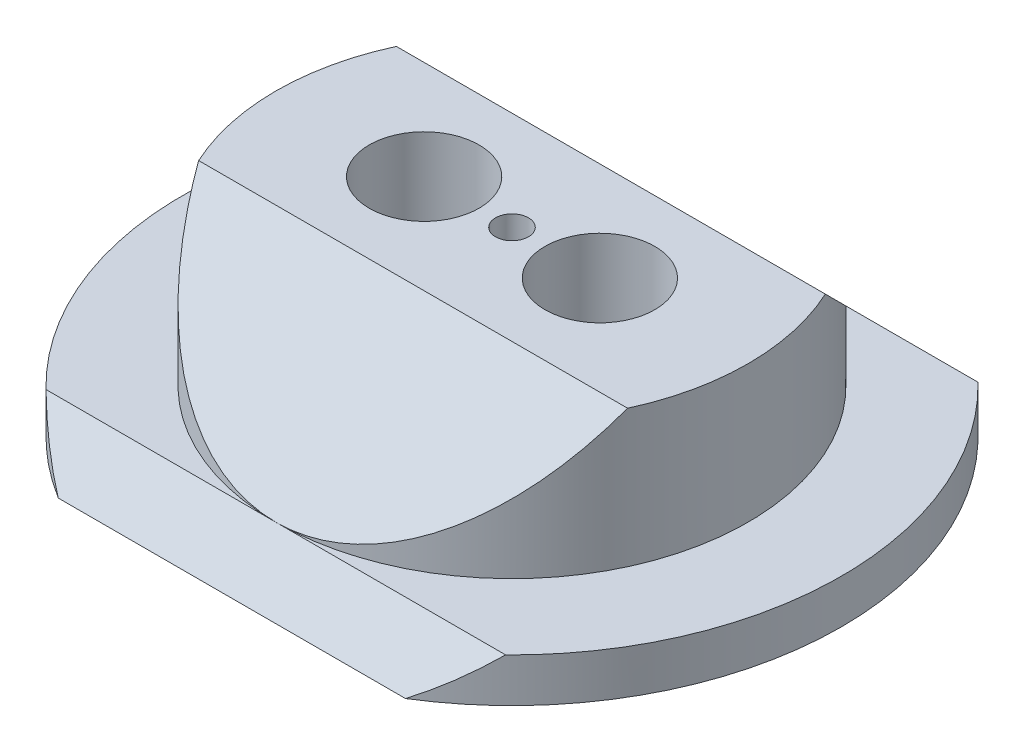
ISO-10303-21;
HEADER;
FILE_DESCRIPTION(('STEP AP214'),'2;1');
FILE_NAME('part.step','',(''),(''),'','','');
FILE_SCHEMA(('AUTOMOTIVE_DESIGN { 1 0 10303 214 1 1 1 1 }'));
ENDSEC;
DATA;
#1=APPLICATION_CONTEXT('core data for automotive mechanical design processes');
#2=APPLICATION_PROTOCOL_DEFINITION('international standard','automotive_design',2000,#1);
#3=PRODUCT_CONTEXT('',#1,'mechanical');
#4=PRODUCT('Part','Part','',(#3));
#5=PRODUCT_RELATED_PRODUCT_CATEGORY('part','',(#4));
#6=PRODUCT_DEFINITION_FORMATION('','',#4);
#7=PRODUCT_DEFINITION_CONTEXT('part definition',#1,'design');
#8=PRODUCT_DEFINITION('design','',#6,#7);
#9=PRODUCT_DEFINITION_SHAPE('','',#8);
#10=(LENGTH_UNIT() NAMED_UNIT(*) SI_UNIT(.MILLI.,.METRE.));
#11=(NAMED_UNIT(*) PLANE_ANGLE_UNIT() SI_UNIT($,.RADIAN.));
#12=(NAMED_UNIT(*) SI_UNIT($,.STERADIAN.) SOLID_ANGLE_UNIT());
#13=UNCERTAINTY_MEASURE_WITH_UNIT(LENGTH_MEASURE(1.E-05),#10,'distance_accuracy_value','');
#14=(GEOMETRIC_REPRESENTATION_CONTEXT(3) GLOBAL_UNCERTAINTY_ASSIGNED_CONTEXT((#13)) GLOBAL_UNIT_ASSIGNED_CONTEXT((#10,
#11,#12)) REPRESENTATION_CONTEXT('',''));
#15=CARTESIAN_POINT('',(0.,0.,0.));
#16=DIRECTION('',(0.,0.,1.));
#17=DIRECTION('',(1.,0.,0.));
#18=AXIS2_PLACEMENT_3D('',#15,#16,#17);
#19=CARTESIAN_POINT('',(0.,0.,0.));
#20=DIRECTION('',(0.,1.,0.));
#21=DIRECTION('',(0.,0.,1.));
#22=AXIS2_PLACEMENT_3D('',#19,#20,#21);
#23=PLANE('',#22);
#24=CARTESIAN_POINT('',(22.,0.,0.));
#25=DIRECTION('',(0.,-1.,0.));
#26=DIRECTION('',(0.,0.,-1.));
#27=AXIS2_PLACEMENT_3D('',#24,#25,#26);
#28=CIRCLE('',#27,5.);
#29=CARTESIAN_POINT('',(22.,0.,-5.));
#30=VERTEX_POINT('',#29);
#31=EDGE_CURVE('E254',#30,#30,#28,.T.);
#32=ORIENTED_EDGE('',*,*,#31,.F.);
#33=EDGE_LOOP('',(#32));
#34=FACE_BOUND('',#33,.T.);
#35=CARTESIAN_POINT('',(0.,0.,15.));
#36=DIRECTION('',(0.,-1.,0.));
#37=DIRECTION('',(0.,0.,-1.));
#38=AXIS2_PLACEMENT_3D('',#35,#36,#37);
#39=CIRCLE('',#38,5.);
#40=CARTESIAN_POINT('',(0.,0.,10.));
#41=VERTEX_POINT('',#40);
#42=EDGE_CURVE('E246',#41,#41,#39,.T.);
#43=ORIENTED_EDGE('',*,*,#42,.F.);
#44=EDGE_LOOP('',(#43));
#45=FACE_BOUND('',#44,.T.);
#46=CARTESIAN_POINT('',(-22.,0.,0.));
#47=DIRECTION('',(0.,-1.,0.));
#48=DIRECTION('',(0.,0.,-1.));
#49=AXIS2_PLACEMENT_3D('',#46,#47,#48);
#50=CIRCLE('',#49,5.);
#51=CARTESIAN_POINT('',(-22.,0.,-5.));
#52=VERTEX_POINT('',#51);
#53=EDGE_CURVE('E238',#52,#52,#50,.T.);
#54=ORIENTED_EDGE('',*,*,#53,.F.);
#55=EDGE_LOOP('',(#54));
#56=FACE_BOUND('',#55,.T.);
#57=CARTESIAN_POINT('',(-14.,0.,12.));
#58=DIRECTION('',(0.,-1.,0.));
#59=DIRECTION('',(0.,0.,-1.));
#60=AXIS2_PLACEMENT_3D('',#57,#58,#59);
#61=CIRCLE('',#60,5.);
#62=CARTESIAN_POINT('',(-14.,0.,7.));
#63=VERTEX_POINT('',#62);
#64=EDGE_CURVE('E229',#63,#63,#61,.T.);
#65=ORIENTED_EDGE('',*,*,#64,.F.);
#66=EDGE_LOOP('',(#65));
#67=FACE_BOUND('',#66,.T.);
#68=CARTESIAN_POINT('',(14.,0.,12.));
#69=DIRECTION('',(0.,-1.,0.));
#70=DIRECTION('',(0.,0.,-1.));
#71=AXIS2_PLACEMENT_3D('',#68,#69,#70);
#72=CIRCLE('',#71,5.);
#73=CARTESIAN_POINT('',(14.,0.,7.));
#74=VERTEX_POINT('',#73);
#75=EDGE_CURVE('E277',#74,#74,#72,.T.);
#76=ORIENTED_EDGE('',*,*,#75,.F.);
#77=EDGE_LOOP('',(#76));
#78=FACE_BOUND('',#77,.T.);
#79=CARTESIAN_POINT('',(14.,0.,-12.));
#80=DIRECTION('',(0.,-1.,0.));
#81=DIRECTION('',(0.,0.,-1.));
#82=AXIS2_PLACEMENT_3D('',#79,#80,#81);
#83=CIRCLE('',#82,5.);
#84=CARTESIAN_POINT('',(14.,0.,-17.));
#85=VERTEX_POINT('',#84);
#86=EDGE_CURVE('E269',#85,#85,#83,.T.);
#87=ORIENTED_EDGE('',*,*,#86,.F.);
#88=EDGE_LOOP('',(#87));
#89=FACE_BOUND('',#88,.T.);
#90=CARTESIAN_POINT('',(-14.,0.,-12.));
#91=DIRECTION('',(0.,-1.,0.));
#92=DIRECTION('',(0.,0.,-1.));
#93=AXIS2_PLACEMENT_3D('',#90,#91,#92);
#94=CIRCLE('',#93,5.);
#95=CARTESIAN_POINT('',(-14.,0.,-17.));
#96=VERTEX_POINT('',#95);
#97=EDGE_CURVE('E261',#96,#96,#94,.T.);
#98=ORIENTED_EDGE('',*,*,#97,.F.);
#99=EDGE_LOOP('',(#98));
#100=FACE_BOUND('',#99,.T.);
#101=CARTESIAN_POINT('',(0.,0.,-15.));
#102=DIRECTION('',(0.,-1.,0.));
#103=DIRECTION('',(0.,0.,-1.));
#104=AXIS2_PLACEMENT_3D('',#101,#102,#103);
#105=CIRCLE('',#104,5.);
#106=CARTESIAN_POINT('',(0.,0.,-20.));
#107=VERTEX_POINT('',#106);
#108=EDGE_CURVE('E221',#107,#107,#105,.T.);
#109=ORIENTED_EDGE('',*,*,#108,.F.);
#110=EDGE_LOOP('',(#109));
#111=FACE_BOUND('',#110,.T.);
#112=CARTESIAN_POINT('',(0.,0.,0.));
#113=DIRECTION('',(0.,1.,0.));
#114=DIRECTION('',(0.,0.,1.));
#115=AXIS2_PLACEMENT_3D('',#112,#113,#114);
#116=CIRCLE('',#115,1.5);
#117=CARTESIAN_POINT('',(0.,0.,1.5));
#118=VERTEX_POINT('',#117);
#119=EDGE_CURVE('E209',#118,#118,#116,.T.);
#120=ORIENTED_EDGE('',*,*,#119,.T.);
#121=EDGE_LOOP('',(#120));
#122=FACE_BOUND('',#121,.T.);
#123=CARTESIAN_POINT('',(-8.,0.,0.));
#124=DIRECTION('',(0.,1.,0.));
#125=DIRECTION('',(0.,0.,1.));
#126=AXIS2_PLACEMENT_3D('',#123,#124,#125);
#127=CIRCLE('',#126,5.);
#128=CARTESIAN_POINT('',(-8.,0.,5.));
#129=VERTEX_POINT('',#128);
#130=EDGE_CURVE('E196',#129,#129,#127,.T.);
#131=ORIENTED_EDGE('',*,*,#130,.T.);
#132=EDGE_LOOP('',(#131));
#133=FACE_BOUND('',#132,.T.);
#134=CARTESIAN_POINT('',(8.,0.,0.));
#135=DIRECTION('',(0.,1.,0.));
#136=DIRECTION('',(0.,0.,1.));
#137=AXIS2_PLACEMENT_3D('',#134,#135,#136);
#138=CIRCLE('',#137,5.);
#139=CARTESIAN_POINT('',(8.,0.,5.));
#140=VERTEX_POINT('',#139);
#141=EDGE_CURVE('E200',#140,#140,#138,.T.);
#142=ORIENTED_EDGE('',*,*,#141,.T.);
#143=EDGE_LOOP('',(#142));
#144=FACE_BOUND('',#143,.T.);
#145=DIRECTION('',(1.,0.,0.));
#146=VECTOR('',#145,1.);
#147=CARTESIAN_POINT('',(0.,0.,25.5));
#148=LINE('',#147,#146);
#149=CARTESIAN_POINT('',(-15.8034806292791,0.,25.5));
#150=VERTEX_POINT('',#149);
#151=CARTESIAN_POINT('',(15.8034806292791,0.,25.5));
#152=VERTEX_POINT('',#151);
#153=EDGE_CURVE('E175',#150,#152,#148,.T.);
#154=ORIENTED_EDGE('',*,*,#153,.F.);
#155=CARTESIAN_POINT('',(0.,0.,0.));
#156=DIRECTION('',(0.,1.,0.));
#157=DIRECTION('',(0.,0.,1.));
#158=AXIS2_PLACEMENT_3D('',#155,#156,#157);
#159=CIRCLE('',#158,30.);
#160=CARTESIAN_POINT('',(-15.8034806292789,0.,-25.5000000000001));
#161=VERTEX_POINT('',#160);
#162=EDGE_CURVE('E128',#161,#150,#159,.T.);
#163=ORIENTED_EDGE('',*,*,#162,.F.);
#164=DIRECTION('',(-1.,0.,0.));
#165=VECTOR('',#164,1.);
#166=CARTESIAN_POINT('',(0.,0.,-25.5000000000001));
#167=LINE('',#166,#165);
#168=CARTESIAN_POINT('',(15.8034806292789,0.,-25.5000000000001));
#169=VERTEX_POINT('',#168);
#170=EDGE_CURVE('E172',#169,#161,#167,.T.);
#171=ORIENTED_EDGE('',*,*,#170,.F.);
#172=EDGE_CURVE('E155',#152,#169,#159,.T.);
#173=ORIENTED_EDGE('',*,*,#172,.F.);
#174=EDGE_LOOP('',(#154,#163,#171,#173));
#175=FACE_BOUND('',#174,.T.);
#176=ADVANCED_FACE('F57',(#34,#45,#56,#67,#78,#89,#100,#111,#122,#133,#144,#175),#23,.F.);
#177=CARTESIAN_POINT('',(0.,4.,0.));
#178=DIRECTION('',(0.,-1.,0.));
#179=DIRECTION('',(0.,0.,-1.));
#180=AXIS2_PLACEMENT_3D('',#177,#178,#179);
#181=CYLINDRICAL_SURFACE('',#180,30.);
#182=CARTESIAN_POINT('',(0.,4.,0.));
#183=DIRECTION('',(0.,1.,0.));
#184=DIRECTION('',(0.,0.,1.));
#185=AXIS2_PLACEMENT_3D('',#182,#183,#184);
#186=CIRCLE('',#185,30.);
#187=CARTESIAN_POINT('',(20.9224759529077,4.,21.5));
#188=VERTEX_POINT('',#187);
#189=CARTESIAN_POINT('',(20.9224759529077,4.,-21.5));
#190=VERTEX_POINT('',#189);
#191=EDGE_CURVE('E183',#188,#190,#186,.T.);
#192=ORIENTED_EDGE('',*,*,#191,.F.);
#193=CARTESIAN_POINT('',(0.,25.4999999999998,0.));
#194=DIRECTION('',(0.,-0.707106781186551,-0.707106781186544));
#195=DIRECTION('',(0.,-0.707106781186544,0.707106781186551));
#196=AXIS2_PLACEMENT_3D('',#193,#194,#195);
#197=ELLIPSE('',#196,42.4264068711926,30.);
#198=EDGE_CURVE('E80',#152,#188,#197,.F.);
#199=ORIENTED_EDGE('',*,*,#198,.F.);
#200=ORIENTED_EDGE('',*,*,#172,.T.);
#201=CARTESIAN_POINT('',(0.,25.4999999999995,0.));
#202=DIRECTION('',(0.,-0.707106781186556,0.707106781186539));
#203=DIRECTION('',(0.,-0.707106781186539,-0.707106781186556));
#204=AXIS2_PLACEMENT_3D('',#201,#202,#203);
#205=ELLIPSE('',#204,42.4264068711924,30.);
#206=EDGE_CURVE('E147',#190,#169,#205,.F.);
#207=ORIENTED_EDGE('',*,*,#206,.F.);
#208=EDGE_LOOP('',(#192,#199,#200,#207));
#209=FACE_BOUND('',#208,.T.);
#210=ADVANCED_FACE('F59',(#209),#181,.T.);
#211=CARTESIAN_POINT('',(0.,4.,0.));
#212=DIRECTION('',(0.,1.,0.));
#213=DIRECTION('',(0.,0.,1.));
#214=AXIS2_PLACEMENT_3D('',#211,#212,#213);
#215=CIRCLE('',#214,30.);
#216=CARTESIAN_POINT('',(-20.9224759529077,4.,-21.5));
#217=VERTEX_POINT('',#216);
#218=CARTESIAN_POINT('',(-20.9224759529077,4.,21.5));
#219=VERTEX_POINT('',#218);
#220=EDGE_CURVE('E186',#217,#219,#215,.T.);
#221=ORIENTED_EDGE('',*,*,#220,.F.);
#222=CARTESIAN_POINT('',(0.,25.4999999999995,0.));
#223=DIRECTION('',(0.,0.707106781186556,-0.707106781186539));
#224=DIRECTION('',(0.,-0.707106781186539,-0.707106781186556));
#225=AXIS2_PLACEMENT_3D('',#222,#223,#224);
#226=ELLIPSE('',#225,42.4264068711924,30.);
#227=EDGE_CURVE('E169',#217,#161,#226,.F.);
#228=ORIENTED_EDGE('',*,*,#227,.T.);
#229=ORIENTED_EDGE('',*,*,#162,.T.);
#230=CARTESIAN_POINT('',(0.,25.4999999999998,0.));
#231=DIRECTION('',(0.,0.707106781186551,0.707106781186544));
#232=DIRECTION('',(0.,-0.707106781186544,0.707106781186551));
#233=AXIS2_PLACEMENT_3D('',#230,#231,#232);
#234=ELLIPSE('',#233,42.4264068711926,30.);
#235=EDGE_CURVE('E149',#150,#219,#234,.F.);
#236=ORIENTED_EDGE('',*,*,#235,.T.);
#237=EDGE_LOOP('',(#221,#228,#229,#236));
#238=FACE_BOUND('',#237,.T.);
#239=ADVANCED_FACE('F316',(#238),#181,.T.);
#240=CARTESIAN_POINT('',(30.001,16.5,8.99999999999987));
#241=DIRECTION('',(0.,-0.707106781186551,-0.707106781186544));
#242=DIRECTION('',(0.,0.707106781186544,-0.707106781186551));
#243=AXIS2_PLACEMENT_3D('',#240,#241,#242);
#244=PLANE('',#243);
#245=DIRECTION('',(1.,0.,0.));
#246=VECTOR('',#245,1.);
#247=CARTESIAN_POINT('',(30.001,4.,21.5));
#248=LINE('',#247,#246);
#249=CARTESIAN_POINT('',(0.,3.99999999999999,21.5));
#250=VERTEX_POINT('',#249);
#251=EDGE_CURVE('E179',#219,#250,#248,.T.);
#252=ORIENTED_EDGE('',*,*,#251,.F.);
#253=ORIENTED_EDGE('',*,*,#235,.F.);
#254=ORIENTED_EDGE('',*,*,#153,.T.);
#255=ORIENTED_EDGE('',*,*,#198,.T.);
#256=EDGE_CURVE('E180',#250,#188,#248,.T.);
#257=ORIENTED_EDGE('',*,*,#256,.F.);
#258=EDGE_LOOP('',(#252,#253,#254,#255,#257));
#259=FACE_BOUND('',#258,.T.);
#260=ADVANCED_FACE('F312',(#259),#244,.F.);
#261=CARTESIAN_POINT('',(30.001,16.5,-8.99999999999971));
#262=DIRECTION('',(0.,-0.707106781186556,0.707106781186539));
#263=DIRECTION('',(0.,-0.707106781186539,-0.707106781186556));
#264=AXIS2_PLACEMENT_3D('',#261,#262,#263);
#265=PLANE('',#264);
#266=DIRECTION('',(-1.,0.,0.));
#267=VECTOR('',#266,1.);
#268=CARTESIAN_POINT('',(30.001,4.,-21.5));
#269=LINE('',#268,#267);
#270=CARTESIAN_POINT('',(0.,4.,-21.5));
#271=VERTEX_POINT('',#270);
#272=EDGE_CURVE('E13',#190,#271,#269,.T.);
#273=ORIENTED_EDGE('',*,*,#272,.F.);
#274=ORIENTED_EDGE('',*,*,#206,.T.);
#275=ORIENTED_EDGE('',*,*,#170,.T.);
#276=ORIENTED_EDGE('',*,*,#227,.F.);
#277=EDGE_CURVE('E61',#271,#217,#269,.T.);
#278=ORIENTED_EDGE('',*,*,#277,.F.);
#279=EDGE_LOOP('',(#273,#274,#275,#276,#278));
#280=FACE_BOUND('',#279,.T.);
#281=ADVANCED_FACE('F320',(#280),#265,.F.);
#282=CARTESIAN_POINT('',(0.,96.0338927753446,0.));
#283=DIRECTION('',(0.,-1.,0.));
#284=DIRECTION('',(0.,0.,-1.));
#285=AXIS2_PLACEMENT_3D('',#282,#283,#284);
#286=CYLINDRICAL_SURFACE('',#285,21.5);
#287=CARTESIAN_POINT('',(0.,4.,0.));
#288=DIRECTION('',(0.,1.,0.));
#289=DIRECTION('',(0.,0.,1.));
#290=AXIS2_PLACEMENT_3D('',#287,#288,#289);
#291=CIRCLE('',#290,21.5);
#292=EDGE_CURVE('E124',#250,#271,#291,.T.);
#293=ORIENTED_EDGE('',*,*,#292,.T.);
#294=CARTESIAN_POINT('',(0.,25.4999999999995,0.));
#295=DIRECTION('',(0.,-0.707106781186556,0.707106781186539));
#296=DIRECTION('',(0.,-0.707106781186539,-0.707106781186556));
#297=AXIS2_PLACEMENT_3D('',#294,#295,#296);
#298=ELLIPSE('',#297,30.4055915910212,21.5);
#299=CARTESIAN_POINT('',(19.5256241897668,16.5,-8.99999999999971));
#300=VERTEX_POINT('',#299);
#301=EDGE_CURVE('E73',#300,#271,#298,.F.);
#302=ORIENTED_EDGE('',*,*,#301,.F.);
#303=CARTESIAN_POINT('',(0.,16.5,0.));
#304=DIRECTION('',(0.,-1.,0.));
#305=DIRECTION('',(0.,0.,-1.));
#306=AXIS2_PLACEMENT_3D('',#303,#304,#305);
#307=CIRCLE('',#306,21.5);
#308=CARTESIAN_POINT('',(19.5256241897667,16.5,8.99999999999987));
#309=VERTEX_POINT('',#308);
#310=EDGE_CURVE('E121',#300,#309,#307,.T.);
#311=ORIENTED_EDGE('',*,*,#310,.T.);
#312=CARTESIAN_POINT('',(0.,25.4999999999998,0.));
#313=DIRECTION('',(0.,-0.707106781186551,-0.707106781186544));
#314=DIRECTION('',(0.,-0.707106781186544,0.707106781186551));
#315=AXIS2_PLACEMENT_3D('',#312,#313,#314);
#316=ELLIPSE('',#315,30.4055915910214,21.5);
#317=EDGE_CURVE('E189',#250,#309,#316,.F.);
#318=ORIENTED_EDGE('',*,*,#317,.F.);
#319=EDGE_LOOP('',(#293,#302,#311,#318));
#320=FACE_BOUND('',#319,.T.);
#321=ADVANCED_FACE('F119',(#320),#286,.T.);
#322=CARTESIAN_POINT('',(0.,4.,0.));
#323=DIRECTION('',(0.,1.,0.));
#324=DIRECTION('',(0.,0.,1.));
#325=AXIS2_PLACEMENT_3D('',#322,#323,#324);
#326=PLANE('',#325);
#327=ORIENTED_EDGE('',*,*,#256,.T.);
#328=ORIENTED_EDGE('',*,*,#191,.T.);
#329=ORIENTED_EDGE('',*,*,#272,.T.);
#330=ORIENTED_EDGE('',*,*,#292,.F.);
#331=EDGE_LOOP('',(#327,#328,#329,#330));
#332=FACE_BOUND('',#331,.T.);
#333=ADVANCED_FACE('F333',(#332),#326,.T.);
#334=ORIENTED_EDGE('',*,*,#251,.T.);
#335=EDGE_CURVE('E195',#271,#250,#291,.T.);
#336=ORIENTED_EDGE('',*,*,#335,.F.);
#337=ORIENTED_EDGE('',*,*,#277,.T.);
#338=ORIENTED_EDGE('',*,*,#220,.T.);
#339=EDGE_LOOP('',(#334,#336,#337,#338));
#340=FACE_BOUND('',#339,.T.);
#341=ADVANCED_FACE('F323',(#340),#326,.T.);
#342=CARTESIAN_POINT('',(-19.5256241897667,16.5,8.99999999999987));
#343=VERTEX_POINT('',#342);
#344=CARTESIAN_POINT('',(-19.5256241897668,16.5,-8.99999999999971));
#345=VERTEX_POINT('',#344);
#346=EDGE_CURVE('E139',#343,#345,#307,.T.);
#347=ORIENTED_EDGE('',*,*,#346,.T.);
#348=EDGE_CURVE('E127',#271,#345,#298,.F.);
#349=ORIENTED_EDGE('',*,*,#348,.F.);
#350=ORIENTED_EDGE('',*,*,#335,.T.);
#351=EDGE_CURVE('E138',#343,#250,#316,.F.);
#352=ORIENTED_EDGE('',*,*,#351,.F.);
#353=EDGE_LOOP('',(#347,#349,#350,#352));
#354=FACE_BOUND('',#353,.T.);
#355=ADVANCED_FACE('F326',(#354),#286,.T.);
#356=ORIENTED_EDGE('',*,*,#301,.T.);
#357=ORIENTED_EDGE('',*,*,#348,.T.);
#358=DIRECTION('',(-1.,0.,0.));
#359=VECTOR('',#358,1.);
#360=CARTESIAN_POINT('',(30.001,16.5,-8.99999999999971));
#361=LINE('',#360,#359);
#362=EDGE_CURVE('E134',#300,#345,#361,.T.);
#363=ORIENTED_EDGE('',*,*,#362,.F.);
#364=EDGE_LOOP('',(#356,#357,#363));
#365=FACE_BOUND('',#364,.T.);
#366=ADVANCED_FACE('F141',(#365),#265,.F.);
#367=CARTESIAN_POINT('',(30.001,16.5,8.99999999999987));
#368=DIRECTION('',(0.,-1.,0.));
#369=DIRECTION('',(0.,0.,-1.));
#370=AXIS2_PLACEMENT_3D('',#367,#368,#369);
#371=PLANE('',#370);
#372=CARTESIAN_POINT('',(0.,16.5,0.));
#373=DIRECTION('',(0.,1.,0.));
#374=DIRECTION('',(0.,0.,1.));
#375=AXIS2_PLACEMENT_3D('',#372,#373,#374);
#376=CIRCLE('',#375,1.5);
#377=CARTESIAN_POINT('',(0.,16.5,1.50000000000001));
#378=VERTEX_POINT('',#377);
#379=EDGE_CURVE('E216',#378,#378,#376,.T.);
#380=ORIENTED_EDGE('',*,*,#379,.F.);
#381=EDGE_LOOP('',(#380));
#382=FACE_BOUND('',#381,.T.);
#383=CARTESIAN_POINT('',(-8.,16.5,0.));
#384=DIRECTION('',(0.,1.,0.));
#385=DIRECTION('',(0.,0.,1.));
#386=AXIS2_PLACEMENT_3D('',#383,#384,#385);
#387=CIRCLE('',#386,5.);
#388=CARTESIAN_POINT('',(-8.,16.5,5.00000000000001));
#389=VERTEX_POINT('',#388);
#390=EDGE_CURVE('E204',#389,#389,#387,.T.);
#391=ORIENTED_EDGE('',*,*,#390,.F.);
#392=EDGE_LOOP('',(#391));
#393=FACE_BOUND('',#392,.T.);
#394=CARTESIAN_POINT('',(8.,16.5,0.));
#395=DIRECTION('',(0.,1.,0.));
#396=DIRECTION('',(0.,0.,1.));
#397=AXIS2_PLACEMENT_3D('',#394,#395,#396);
#398=CIRCLE('',#397,5.);
#399=CARTESIAN_POINT('',(8.,16.5,5.));
#400=VERTEX_POINT('',#399);
#401=EDGE_CURVE('E205',#400,#400,#398,.T.);
#402=ORIENTED_EDGE('',*,*,#401,.F.);
#403=EDGE_LOOP('',(#402));
#404=FACE_BOUND('',#403,.T.);
#405=ORIENTED_EDGE('',*,*,#362,.T.);
#406=ORIENTED_EDGE('',*,*,#346,.F.);
#407=DIRECTION('',(-1.,0.,0.));
#408=VECTOR('',#407,1.);
#409=CARTESIAN_POINT('',(30.001,16.5,8.99999999999987));
#410=LINE('',#409,#408);
#411=EDGE_CURVE('E136',#309,#343,#410,.T.);
#412=ORIENTED_EDGE('',*,*,#411,.F.);
#413=ORIENTED_EDGE('',*,*,#310,.F.);
#414=EDGE_LOOP('',(#405,#406,#412,#413));
#415=FACE_BOUND('',#414,.T.);
#416=ADVANCED_FACE('F132',(#382,#393,#404,#415),#371,.F.);
#417=ORIENTED_EDGE('',*,*,#351,.T.);
#418=ORIENTED_EDGE('',*,*,#317,.T.);
#419=ORIENTED_EDGE('',*,*,#411,.T.);
#420=EDGE_LOOP('',(#417,#418,#419));
#421=FACE_BOUND('',#420,.T.);
#422=ADVANCED_FACE('F331',(#421),#244,.F.);
#423=CARTESIAN_POINT('',(8.,-7.50000000000001,0.));
#424=DIRECTION('',(0.,1.,0.));
#425=DIRECTION('',(0.,0.,1.));
#426=AXIS2_PLACEMENT_3D('',#423,#424,#425);
#427=CYLINDRICAL_SURFACE('',#426,5.);
#428=ORIENTED_EDGE('',*,*,#401,.T.);
#429=EDGE_LOOP('',(#428));
#430=FACE_BOUND('',#429,.T.);
#431=ORIENTED_EDGE('',*,*,#141,.F.);
#432=EDGE_LOOP('',(#431));
#433=FACE_BOUND('',#432,.T.);
#434=ADVANCED_FACE('F349',(#430,#433),#427,.F.);
#435=CARTESIAN_POINT('',(-8.,-7.50000000000001,0.));
#436=DIRECTION('',(0.,1.,0.));
#437=DIRECTION('',(0.,0.,1.));
#438=AXIS2_PLACEMENT_3D('',#435,#436,#437);
#439=CYLINDRICAL_SURFACE('',#438,5.);
#440=ORIENTED_EDGE('',*,*,#390,.T.);
#441=EDGE_LOOP('',(#440));
#442=FACE_BOUND('',#441,.T.);
#443=ORIENTED_EDGE('',*,*,#130,.F.);
#444=EDGE_LOOP('',(#443));
#445=FACE_BOUND('',#444,.T.);
#446=ADVANCED_FACE('F354',(#442,#445),#439,.F.);
#447=CARTESIAN_POINT('',(0.,-13.5,0.));
#448=DIRECTION('',(0.,1.,0.));
#449=DIRECTION('',(0.,0.,1.));
#450=AXIS2_PLACEMENT_3D('',#447,#448,#449);
#451=CYLINDRICAL_SURFACE('',#450,1.5);
#452=ORIENTED_EDGE('',*,*,#379,.T.);
#453=EDGE_LOOP('',(#452));
#454=FACE_BOUND('',#453,.T.);
#455=ORIENTED_EDGE('',*,*,#119,.F.);
#456=EDGE_LOOP('',(#455));
#457=FACE_BOUND('',#456,.T.);
#458=ADVANCED_FACE('F370',(#454,#457),#451,.F.);
#459=CARTESIAN_POINT('',(0.,3.,-15.));
#460=DIRECTION('',(0.,-1.,0.));
#461=DIRECTION('',(0.,0.,-1.));
#462=AXIS2_PLACEMENT_3D('',#459,#460,#461);
#463=CYLINDRICAL_SURFACE('',#462,5.);
#464=CARTESIAN_POINT('',(0.,3.,-15.));
#465=DIRECTION('',(0.,-1.,0.));
#466=DIRECTION('',(0.,0.,-1.));
#467=AXIS2_PLACEMENT_3D('',#464,#465,#466);
#468=CIRCLE('',#467,5.);
#469=CARTESIAN_POINT('',(0.,3.,-20.));
#470=VERTEX_POINT('',#469);
#471=EDGE_CURVE('E220',#470,#470,#468,.T.);
#472=ORIENTED_EDGE('',*,*,#471,.F.);
#473=EDGE_LOOP('',(#472));
#474=FACE_BOUND('',#473,.T.);
#475=ORIENTED_EDGE('',*,*,#108,.T.);
#476=EDGE_LOOP('',(#475));
#477=FACE_BOUND('',#476,.T.);
#478=ADVANCED_FACE('F375',(#474,#477),#463,.F.);
#479=CARTESIAN_POINT('',(0.,3.,-15.));
#480=DIRECTION('',(0.,-1.,0.));
#481=DIRECTION('',(0.,0.,-1.));
#482=AXIS2_PLACEMENT_3D('',#479,#480,#481);
#483=PLANE('',#482);
#484=ORIENTED_EDGE('',*,*,#471,.T.);
#485=EDGE_LOOP('',(#484));
#486=FACE_BOUND('',#485,.T.);
#487=ADVANCED_FACE('F439',(#486),#483,.T.);
#488=CARTESIAN_POINT('',(-14.,3.,-12.));
#489=DIRECTION('',(0.,-1.,0.));
#490=DIRECTION('',(0.,0.,-1.));
#491=AXIS2_PLACEMENT_3D('',#488,#489,#490);
#492=CYLINDRICAL_SURFACE('',#491,5.);
#493=CARTESIAN_POINT('',(-14.,3.,-12.));
#494=DIRECTION('',(0.,-1.,0.));
#495=DIRECTION('',(0.,0.,-1.));
#496=AXIS2_PLACEMENT_3D('',#493,#494,#495);
#497=CIRCLE('',#496,5.);
#498=CARTESIAN_POINT('',(-14.,3.,-17.));
#499=VERTEX_POINT('',#498);
#500=EDGE_CURVE('E265',#499,#499,#497,.T.);
#501=ORIENTED_EDGE('',*,*,#500,.F.);
#502=EDGE_LOOP('',(#501));
#503=FACE_BOUND('',#502,.T.);
#504=ORIENTED_EDGE('',*,*,#97,.T.);
#505=EDGE_LOOP('',(#504));
#506=FACE_BOUND('',#505,.T.);
#507=ADVANCED_FACE('F448',(#503,#506),#492,.F.);
#508=CARTESIAN_POINT('',(-14.,3.,-12.));
#509=DIRECTION('',(0.,-1.,0.));
#510=DIRECTION('',(0.,0.,-1.));
#511=AXIS2_PLACEMENT_3D('',#508,#509,#510);
#512=PLANE('',#511);
#513=ORIENTED_EDGE('',*,*,#500,.T.);
#514=EDGE_LOOP('',(#513));
#515=FACE_BOUND('',#514,.T.);
#516=ADVANCED_FACE('F458',(#515),#512,.T.);
#517=CARTESIAN_POINT('',(14.,3.,-12.));
#518=DIRECTION('',(0.,-1.,0.));
#519=DIRECTION('',(0.,0.,-1.));
#520=AXIS2_PLACEMENT_3D('',#517,#518,#519);
#521=CYLINDRICAL_SURFACE('',#520,5.);
#522=CARTESIAN_POINT('',(14.,3.,-12.));
#523=DIRECTION('',(0.,-1.,0.));
#524=DIRECTION('',(0.,0.,-1.));
#525=AXIS2_PLACEMENT_3D('',#522,#523,#524);
#526=CIRCLE('',#525,5.);
#527=CARTESIAN_POINT('',(14.,3.,-17.));
#528=VERTEX_POINT('',#527);
#529=EDGE_CURVE('E273',#528,#528,#526,.T.);
#530=ORIENTED_EDGE('',*,*,#529,.F.);
#531=EDGE_LOOP('',(#530));
#532=FACE_BOUND('',#531,.T.);
#533=ORIENTED_EDGE('',*,*,#86,.T.);
#534=EDGE_LOOP('',(#533));
#535=FACE_BOUND('',#534,.T.);
#536=ADVANCED_FACE('F468',(#532,#535),#521,.F.);
#537=CARTESIAN_POINT('',(14.,3.,-12.));
#538=DIRECTION('',(0.,-1.,0.));
#539=DIRECTION('',(0.,0.,-1.));
#540=AXIS2_PLACEMENT_3D('',#537,#538,#539);
#541=PLANE('',#540);
#542=ORIENTED_EDGE('',*,*,#529,.T.);
#543=EDGE_LOOP('',(#542));
#544=FACE_BOUND('',#543,.T.);
#545=ADVANCED_FACE('F290',(#544),#541,.T.);
#546=CARTESIAN_POINT('',(14.,3.,12.));
#547=DIRECTION('',(0.,-1.,0.));
#548=DIRECTION('',(0.,0.,-1.));
#549=AXIS2_PLACEMENT_3D('',#546,#547,#548);
#550=CYLINDRICAL_SURFACE('',#549,5.);
#551=CARTESIAN_POINT('',(14.,3.,12.));
#552=DIRECTION('',(0.,-1.,0.));
#553=DIRECTION('',(0.,0.,-1.));
#554=AXIS2_PLACEMENT_3D('',#551,#552,#553);
#555=CIRCLE('',#554,5.);
#556=CARTESIAN_POINT('',(14.,3.,7.));
#557=VERTEX_POINT('',#556);
#558=EDGE_CURVE('E234',#557,#557,#555,.T.);
#559=ORIENTED_EDGE('',*,*,#558,.F.);
#560=EDGE_LOOP('',(#559));
#561=FACE_BOUND('',#560,.T.);
#562=ORIENTED_EDGE('',*,*,#75,.T.);
#563=EDGE_LOOP('',(#562));
#564=FACE_BOUND('',#563,.T.);
#565=ADVANCED_FACE('F287',(#561,#564),#550,.F.);
#566=CARTESIAN_POINT('',(14.,3.,12.));
#567=DIRECTION('',(0.,-1.,0.));
#568=DIRECTION('',(0.,0.,-1.));
#569=AXIS2_PLACEMENT_3D('',#566,#567,#568);
#570=PLANE('',#569);
#571=ORIENTED_EDGE('',*,*,#558,.T.);
#572=EDGE_LOOP('',(#571));
#573=FACE_BOUND('',#572,.T.);
#574=ADVANCED_FACE('F285',(#573),#570,.T.);
#575=CARTESIAN_POINT('',(-14.,3.,12.));
#576=DIRECTION('',(0.,-1.,0.));
#577=DIRECTION('',(0.,0.,-1.));
#578=AXIS2_PLACEMENT_3D('',#575,#576,#577);
#579=CYLINDRICAL_SURFACE('',#578,5.);
#580=CARTESIAN_POINT('',(-14.,3.,12.));
#581=DIRECTION('',(0.,-1.,0.));
#582=DIRECTION('',(0.,0.,-1.));
#583=AXIS2_PLACEMENT_3D('',#580,#581,#582);
#584=CIRCLE('',#583,5.);
#585=CARTESIAN_POINT('',(-14.,3.,7.));
#586=VERTEX_POINT('',#585);
#587=EDGE_CURVE('E233',#586,#586,#584,.T.);
#588=ORIENTED_EDGE('',*,*,#587,.F.);
#589=EDGE_LOOP('',(#588));
#590=FACE_BOUND('',#589,.T.);
#591=ORIENTED_EDGE('',*,*,#64,.T.);
#592=EDGE_LOOP('',(#591));
#593=FACE_BOUND('',#592,.T.);
#594=ADVANCED_FACE('F502',(#590,#593),#579,.F.);
#595=CARTESIAN_POINT('',(-14.,3.,12.));
#596=DIRECTION('',(0.,-1.,0.));
#597=DIRECTION('',(0.,0.,-1.));
#598=AXIS2_PLACEMENT_3D('',#595,#596,#597);
#599=PLANE('',#598);
#600=ORIENTED_EDGE('',*,*,#587,.T.);
#601=EDGE_LOOP('',(#600));
#602=FACE_BOUND('',#601,.T.);
#603=ADVANCED_FACE('F511',(#602),#599,.T.);
#604=CARTESIAN_POINT('',(-22.,3.,0.));
#605=DIRECTION('',(0.,-1.,0.));
#606=DIRECTION('',(0.,0.,-1.));
#607=AXIS2_PLACEMENT_3D('',#604,#605,#606);
#608=CYLINDRICAL_SURFACE('',#607,5.);
#609=CARTESIAN_POINT('',(-22.,3.,0.));
#610=DIRECTION('',(0.,-1.,0.));
#611=DIRECTION('',(0.,0.,-1.));
#612=AXIS2_PLACEMENT_3D('',#609,#610,#611);
#613=CIRCLE('',#612,5.);
#614=CARTESIAN_POINT('',(-22.,3.,-5.));
#615=VERTEX_POINT('',#614);
#616=EDGE_CURVE('E242',#615,#615,#613,.T.);
#617=ORIENTED_EDGE('',*,*,#616,.F.);
#618=EDGE_LOOP('',(#617));
#619=FACE_BOUND('',#618,.T.);
#620=ORIENTED_EDGE('',*,*,#53,.T.);
#621=EDGE_LOOP('',(#620));
#622=FACE_BOUND('',#621,.T.);
#623=ADVANCED_FACE('F521',(#619,#622),#608,.F.);
#624=CARTESIAN_POINT('',(-22.,3.,0.));
#625=DIRECTION('',(0.,-1.,0.));
#626=DIRECTION('',(0.,0.,-1.));
#627=AXIS2_PLACEMENT_3D('',#624,#625,#626);
#628=PLANE('',#627);
#629=ORIENTED_EDGE('',*,*,#616,.T.);
#630=EDGE_LOOP('',(#629));
#631=FACE_BOUND('',#630,.T.);
#632=ADVANCED_FACE('F531',(#631),#628,.T.);
#633=CARTESIAN_POINT('',(0.,3.,15.));
#634=DIRECTION('',(0.,-1.,0.));
#635=DIRECTION('',(0.,0.,-1.));
#636=AXIS2_PLACEMENT_3D('',#633,#634,#635);
#637=CYLINDRICAL_SURFACE('',#636,5.);
#638=CARTESIAN_POINT('',(0.,3.,15.));
#639=DIRECTION('',(0.,-1.,0.));
#640=DIRECTION('',(0.,0.,-1.));
#641=AXIS2_PLACEMENT_3D('',#638,#639,#640);
#642=CIRCLE('',#641,5.);
#643=CARTESIAN_POINT('',(0.,3.,10.));
#644=VERTEX_POINT('',#643);
#645=EDGE_CURVE('E250',#644,#644,#642,.T.);
#646=ORIENTED_EDGE('',*,*,#645,.F.);
#647=EDGE_LOOP('',(#646));
#648=FACE_BOUND('',#647,.T.);
#649=ORIENTED_EDGE('',*,*,#42,.T.);
#650=EDGE_LOOP('',(#649));
#651=FACE_BOUND('',#650,.T.);
#652=ADVANCED_FACE('F541',(#648,#651),#637,.F.);
#653=CARTESIAN_POINT('',(0.,3.,15.));
#654=DIRECTION('',(0.,-1.,0.));
#655=DIRECTION('',(0.,0.,-1.));
#656=AXIS2_PLACEMENT_3D('',#653,#654,#655);
#657=PLANE('',#656);
#658=ORIENTED_EDGE('',*,*,#645,.T.);
#659=EDGE_LOOP('',(#658));
#660=FACE_BOUND('',#659,.T.);
#661=ADVANCED_FACE('F551',(#660),#657,.T.);
#662=CARTESIAN_POINT('',(22.,3.,0.));
#663=DIRECTION('',(0.,-1.,0.));
#664=DIRECTION('',(0.,0.,-1.));
#665=AXIS2_PLACEMENT_3D('',#662,#663,#664);
#666=CYLINDRICAL_SURFACE('',#665,5.);
#667=CARTESIAN_POINT('',(22.,3.,0.));
#668=DIRECTION('',(0.,-1.,0.));
#669=DIRECTION('',(0.,0.,-1.));
#670=AXIS2_PLACEMENT_3D('',#667,#668,#669);
#671=CIRCLE('',#670,5.);
#672=CARTESIAN_POINT('',(22.,3.,-5.));
#673=VERTEX_POINT('',#672);
#674=EDGE_CURVE('E225',#673,#673,#671,.T.);
#675=ORIENTED_EDGE('',*,*,#674,.F.);
#676=EDGE_LOOP('',(#675));
#677=FACE_BOUND('',#676,.T.);
#678=ORIENTED_EDGE('',*,*,#31,.T.);
#679=EDGE_LOOP('',(#678));
#680=FACE_BOUND('',#679,.T.);
#681=ADVANCED_FACE('F561',(#677,#680),#666,.F.);
#682=CARTESIAN_POINT('',(22.,3.,0.));
#683=DIRECTION('',(0.,-1.,0.));
#684=DIRECTION('',(0.,0.,-1.));
#685=AXIS2_PLACEMENT_3D('',#682,#683,#684);
#686=PLANE('',#685);
#687=ORIENTED_EDGE('',*,*,#674,.T.);
#688=EDGE_LOOP('',(#687));
#689=FACE_BOUND('',#688,.T.);
#690=ADVANCED_FACE('F571',(#689),#686,.T.);
#691=CLOSED_SHELL('',(#176,#210,#239,#260,#281,#321,#333,#341,#355,#366,#416,#422,#434,#446,
#458,#478,#487,#507,#516,#536,#545,#565,#574,#594,#603,#623,#632,#652,#661,#681,#690));
#692=MANIFOLD_SOLID_BREP('B2',#691);
#693=ADVANCED_BREP_SHAPE_REPRESENTATION('',(#18,#692),#14);
#694=SHAPE_DEFINITION_REPRESENTATION(#9,#693);
ENDSEC;
END-ISO-10303-21;
